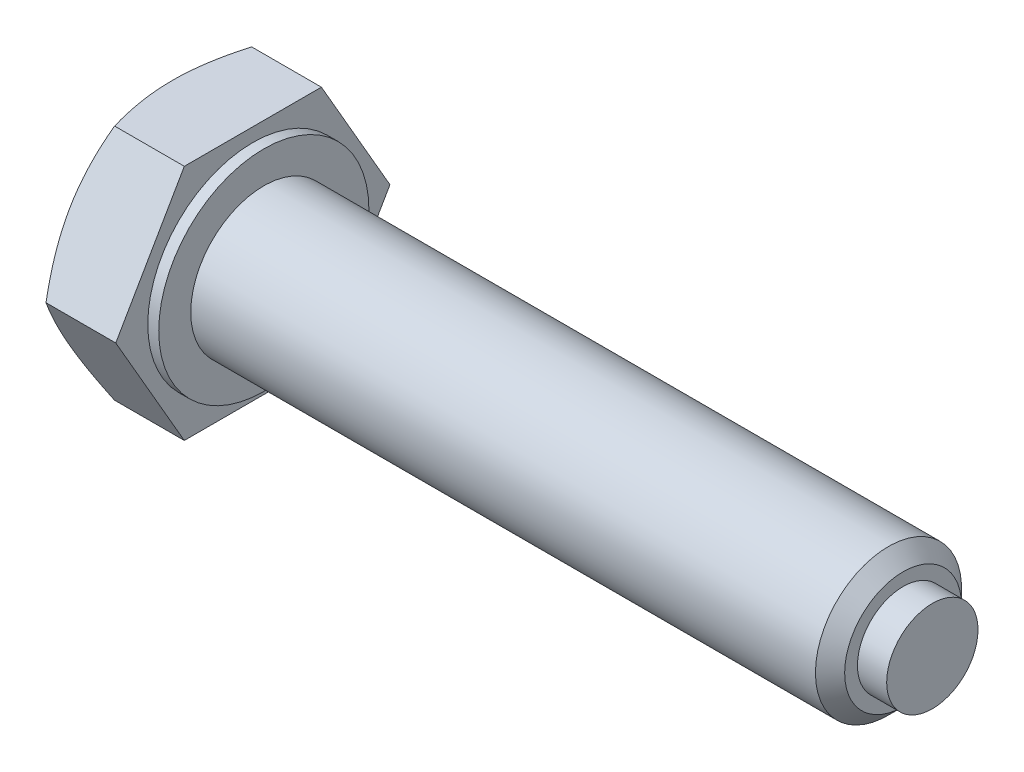
ISO-10303-21;
HEADER;
FILE_DESCRIPTION(('STEP AP214'),'2;1');
FILE_NAME('part.step','',(''),(''),'','','');
FILE_SCHEMA(('AUTOMOTIVE_DESIGN { 1 0 10303 214 1 1 1 1 }'));
ENDSEC;
DATA;
#1=APPLICATION_CONTEXT('core data for automotive mechanical design processes');
#2=APPLICATION_PROTOCOL_DEFINITION('international standard','automotive_design',2000,#1);
#3=PRODUCT_CONTEXT('',#1,'mechanical');
#4=PRODUCT('Part','Part','',(#3));
#5=PRODUCT_RELATED_PRODUCT_CATEGORY('part','',(#4));
#6=PRODUCT_DEFINITION_FORMATION('','',#4);
#7=PRODUCT_DEFINITION_CONTEXT('part definition',#1,'design');
#8=PRODUCT_DEFINITION('design','',#6,#7);
#9=PRODUCT_DEFINITION_SHAPE('','',#8);
#10=(LENGTH_UNIT() NAMED_UNIT(*) SI_UNIT(.MILLI.,.METRE.));
#11=(NAMED_UNIT(*) PLANE_ANGLE_UNIT() SI_UNIT($,.RADIAN.));
#12=(NAMED_UNIT(*) SI_UNIT($,.STERADIAN.) SOLID_ANGLE_UNIT());
#13=UNCERTAINTY_MEASURE_WITH_UNIT(LENGTH_MEASURE(1.E-05),#10,'distance_accuracy_value','');
#14=(GEOMETRIC_REPRESENTATION_CONTEXT(3) GLOBAL_UNCERTAINTY_ASSIGNED_CONTEXT((#13)) GLOBAL_UNIT_ASSIGNED_CONTEXT((#10,
#11,#12)) REPRESENTATION_CONTEXT('',''));
#15=CARTESIAN_POINT('',(0.,0.,0.));
#16=DIRECTION('',(0.,0.,1.));
#17=DIRECTION('',(1.,0.,0.));
#18=AXIS2_PLACEMENT_3D('',#15,#16,#17);
#19=CARTESIAN_POINT('',(4.99999999999989,-3.25000000000036,-5.62916512459921));
#20=DIRECTION('',(0.,-0.500000000000007,-0.866025403784451));
#21=DIRECTION('',(0.,-0.866025403784451,0.500000000000007));
#22=AXIS2_PLACEMENT_3D('',#19,#20,#21);
#23=PLANE('',#22);
#24=CARTESIAN_POINT('',(-4.4194434163996,-6.50000000000041,-3.7527767497329));
#25=CARTESIAN_POINT('',(-4.70121119604637,-5.65469666106277,-4.24081286001544));
#26=CARTESIAN_POINT('',(-4.84366714919919,-4.89166385268671,-4.68135005733187));
#27=CARTESIAN_POINT('',(-5.00000000000039,-4.0543026083986,-5.16480079713057));
#28=CARTESIAN_POINT('',(-5.00000000000039,-3.25000000000036,-5.62916512459921));
#29=B_SPLINE_CURVE_WITH_KNOTS('',2,(#24,#25,#26,#27,#28),.UNSPECIFIED.,.F.,.F.,(3,2,3),(0.,0.5,
1.),.UNSPECIFIED.);
#30=CARTESIAN_POINT('',(-4.41944341639933,-6.50000000000034,-3.75277674973343));
#31=VERTEX_POINT('',#30);
#32=CARTESIAN_POINT('',(-4.99999999999989,-3.25000000000036,-5.62916512459921));
#33=VERTEX_POINT('',#32);
#34=EDGE_CURVE('E437',#31,#33,#29,.T.);
#35=ORIENTED_EDGE('',*,*,#34,.T.);
#36=CARTESIAN_POINT('',(-5.00000000000039,-3.25000000000036,-5.62916512459921));
#37=CARTESIAN_POINT('',(-5.00000000000039,-2.44516175633019,-6.09383870123629));
#38=CARTESIAN_POINT('',(-4.84328039134601,-1.60626522925969,-6.57817583696269));
#39=CARTESIAN_POINT('',(-4.70100428714844,-0.844682612245449,-7.017875765906));
#40=CARTESIAN_POINT('',(-4.4194434163996,-3.15719672627779E-13,-7.50555349946552));
#41=B_SPLINE_CURVE_WITH_KNOTS('',2,(#36,#37,#38,#39,#40),.UNSPECIFIED.,.F.,.F.,(3,2,3),(0.,0.5,
1.),.UNSPECIFIED.);
#42=CARTESIAN_POINT('',(-4.41944341639933,-2.22044604925031E-13,-7.50555349946475));
#43=VERTEX_POINT('',#42);
#44=EDGE_CURVE('E446',#33,#43,#41,.T.);
#45=ORIENTED_EDGE('',*,*,#44,.T.);
#46=DIRECTION('',(-1.,0.,0.));
#47=VECTOR('',#46,1.);
#48=CARTESIAN_POINT('',(4.99999999999989,-2.22044604925031E-13,-7.50555349946475));
#49=LINE('',#48,#47);
#50=CARTESIAN_POINT('',(-0.599999999999934,-2.22044604925031E-13,-7.50555349946475));
#51=VERTEX_POINT('',#50);
#52=EDGE_CURVE('E296',#51,#43,#49,.T.);
#53=ORIENTED_EDGE('',*,*,#52,.F.);
#54=DIRECTION('',(0.,-0.866025403784451,0.500000000000007));
#55=VECTOR('',#54,1.);
#56=CARTESIAN_POINT('',(-0.599999999999934,2.37916512459857,-8.87916512459883));
#57=LINE('',#56,#55);
#58=CARTESIAN_POINT('',(-0.599999999999934,-6.50000000000034,-3.75277674973343));
#59=VERTEX_POINT('',#58);
#60=EDGE_CURVE('E416',#51,#59,#57,.T.);
#61=ORIENTED_EDGE('',*,*,#60,.T.);
#62=DIRECTION('',(-1.,0.,0.));
#63=VECTOR('',#62,1.);
#64=CARTESIAN_POINT('',(4.99999999999989,-6.50000000000034,-3.75277674973343));
#65=LINE('',#64,#63);
#66=EDGE_CURVE('E11',#59,#31,#65,.T.);
#67=ORIENTED_EDGE('',*,*,#66,.T.);
#68=EDGE_LOOP('',(#35,#45,#53,#61,#67));
#69=FACE_BOUND('',#68,.T.);
#70=ADVANCED_FACE('F16',(#69),#23,.T.);
#71=CARTESIAN_POINT('',(4.99999999999989,-6.50000000000123,-5.27355936696949E-13));
#72=DIRECTION('',(0.,-1.00000000000001,0.));
#73=DIRECTION('',(0.,0.,-1.00000000000001));
#74=AXIS2_PLACEMENT_3D('',#71,#72,#73);
#75=PLANE('',#74);
#76=CARTESIAN_POINT('',(-4.4194434163996,-6.50000000000123,3.75277674973209));
#77=CARTESIAN_POINT('',(-4.69982369058386,-6.50000000000123,2.78151098907765));
#78=CARTESIAN_POINT('',(-4.84223781480018,-6.50000000000123,1.90445380224181));
#79=CARTESIAN_POINT('',(-5.00000000000038,-6.50000000000123,0.932875603083793));
#80=CARTESIAN_POINT('',(-5.00000000000038,-6.50000000000123,-5.27355936696949E-13));
#81=B_SPLINE_CURVE_WITH_KNOTS('',2,(#76,#77,#78,#79,#80),.UNSPECIFIED.,.F.,.F.,(3,2,3),(0.,0.5,
1.),.UNSPECIFIED.);
#82=CARTESIAN_POINT('',(-4.41944341639933,-6.50000000000101,3.75277674973262));
#83=VERTEX_POINT('',#82);
#84=CARTESIAN_POINT('',(-4.99999999999989,-6.50000000000123,-5.27355936696949E-13));
#85=VERTEX_POINT('',#84);
#86=EDGE_CURVE('E142',#83,#85,#81,.T.);
#87=ORIENTED_EDGE('',*,*,#86,.T.);
#88=CARTESIAN_POINT('',(-5.00000000000038,-6.50000000000123,-5.27355936696949E-13));
#89=CARTESIAN_POINT('',(-5.00000000000038,-6.50000000000123,-0.925923553282188));
#90=CARTESIAN_POINT('',(-4.84445525213732,-6.50000000000123,-1.89074873679887));
#91=CARTESIAN_POINT('',(-4.7021494592843,-6.50000000000123,-2.77345428996721));
#92=CARTESIAN_POINT('',(-4.4194434163996,-6.50000000000123,-3.75277674973315));
#93=B_SPLINE_CURVE_WITH_KNOTS('',2,(#88,#89,#90,#91,#92),.UNSPECIFIED.,.F.,.F.,(3,2,3),(0.,0.5,
1.),.UNSPECIFIED.);
#94=EDGE_CURVE('E431',#85,#31,#93,.T.);
#95=ORIENTED_EDGE('',*,*,#94,.T.);
#96=ORIENTED_EDGE('',*,*,#66,.F.);
#97=DIRECTION('',(0.,0.,1.00000000000001));
#98=VECTOR('',#97,1.);
#99=CARTESIAN_POINT('',(-0.599999999999934,-6.50000000000123,-5.27355936696949E-13));
#100=LINE('',#99,#98);
#101=CARTESIAN_POINT('',(-0.599999999999934,-6.50000000000101,3.75277674973262));
#102=VERTEX_POINT('',#101);
#103=EDGE_CURVE('E146',#59,#102,#100,.T.);
#104=ORIENTED_EDGE('',*,*,#103,.T.);
#105=DIRECTION('',(-1.,0.,0.));
#106=VECTOR('',#105,1.);
#107=CARTESIAN_POINT('',(4.99999999999989,-6.50000000000101,3.75277674973262));
#108=LINE('',#107,#106);
#109=EDGE_CURVE('E28',#102,#83,#108,.T.);
#110=ORIENTED_EDGE('',*,*,#109,.T.);
#111=EDGE_LOOP('',(#87,#95,#96,#104,#110));
#112=FACE_BOUND('',#111,.T.);
#113=ADVANCED_FACE('F139',(#112),#75,.T.);
#114=CARTESIAN_POINT('',(4.99999999999989,-3.25000000000103,5.62916512459907));
#115=DIRECTION('',(0.,-0.500000000000006,0.86602540378445));
#116=DIRECTION('',(-1.,0.,0.));
#117=AXIS2_PLACEMENT_3D('',#114,#115,#116);
#118=PLANE('',#117);
#119=CARTESIAN_POINT('',(-4.41944341639934,-9.8879238130678E-13,7.50555349946538));
#120=CARTESIAN_POINT('',(-4.70121119604643,-0.845303338939596,7.01751738918229));
#121=CARTESIAN_POINT('',(-4.84366714919891,-1.60833614731469,6.57698019186641));
#122=CARTESIAN_POINT('',(-5.00000000000011,-2.44569739160364,6.09352945206722));
#123=CARTESIAN_POINT('',(-5.00000000000011,-3.25000000000103,5.62916512459907));
#124=B_SPLINE_CURVE_WITH_KNOTS('',2,(#119,#120,#121,#122,#123),.UNSPECIFIED.,.F.,.F.,(3,2,3),
(0.,0.5,1.),.UNSPECIFIED.);
#125=CARTESIAN_POINT('',(-4.41944341639933,-6.66133814775094E-13,7.5055534994653));
#126=VERTEX_POINT('',#125);
#127=CARTESIAN_POINT('',(-4.99999999999989,-3.25000000000103,5.62916512459907));
#128=VERTEX_POINT('',#127);
#129=EDGE_CURVE('E159',#126,#128,#124,.T.);
#130=ORIENTED_EDGE('',*,*,#129,.T.);
#131=CARTESIAN_POINT('',(-5.00000000000011,-3.25000000000103,5.62916512459907));
#132=CARTESIAN_POINT('',(-5.00000000000011,-4.0548382436712,5.16449154796199));
#133=CARTESIAN_POINT('',(-4.84328039134573,-4.8937347707417,4.6801544122356));
#134=CARTESIAN_POINT('',(-4.70100428714817,-5.65531738775594,4.24045448329229));
#135=CARTESIAN_POINT('',(-4.41944341639934,-6.50000000000107,3.75277674973276));
#136=B_SPLINE_CURVE_WITH_KNOTS('',2,(#131,#132,#133,#134,#135),.UNSPECIFIED.,.F.,.F.,(3,2,3),
(0.,0.5,1.),.UNSPECIFIED.);
#137=EDGE_CURVE('E155',#128,#83,#136,.T.);
#138=ORIENTED_EDGE('',*,*,#137,.T.);
#139=ORIENTED_EDGE('',*,*,#109,.F.);
#140=DIRECTION('',(0.,0.86602540378445,0.500000000000006));
#141=VECTOR('',#140,1.);
#142=CARTESIAN_POINT('',(-0.599999999999934,2.37916512459868,8.87916512459883));
#143=LINE('',#142,#141);
#144=CARTESIAN_POINT('',(-0.599999999999934,-6.66133814775094E-13,7.5055534994653));
#145=VERTEX_POINT('',#144);
#146=EDGE_CURVE('E389',#102,#145,#143,.T.);
#147=ORIENTED_EDGE('',*,*,#146,.T.);
#148=DIRECTION('',(-1.,0.,0.));
#149=VECTOR('',#148,1.);
#150=CARTESIAN_POINT('',(4.99999999999989,-6.66133814775094E-13,7.5055534994653));
#151=LINE('',#150,#149);
#152=EDGE_CURVE('E151',#145,#126,#151,.T.);
#153=ORIENTED_EDGE('',*,*,#152,.T.);
#154=EDGE_LOOP('',(#130,#138,#139,#147,#153));
#155=FACE_BOUND('',#154,.T.);
#156=ADVANCED_FACE('F157',(#155),#118,.T.);
#157=CARTESIAN_POINT('',(4.99999999999989,3.24999999999931,5.62916512459874));
#158=DIRECTION('',(0.,0.500000000000007,0.866025403784451));
#159=DIRECTION('',(1.,0.,0.));
#160=AXIS2_PLACEMENT_3D('',#157,#158,#159);
#161=PLANE('',#160);
#162=CARTESIAN_POINT('',(-4.41944341639934,6.49999999999936,3.75277674973243));
#163=CARTESIAN_POINT('',(-4.70121119604959,5.65469666105128,4.24081286002099));
#164=CARTESIAN_POINT('',(-4.84366714919891,4.89166385268566,4.6813500573314));
#165=CARTESIAN_POINT('',(-5.00000000000011,4.05430260838852,5.16480079713531));
#166=CARTESIAN_POINT('',(-5.00000000000011,3.24999999999931,5.62916512459874));
#167=B_SPLINE_CURVE_WITH_KNOTS('',2,(#162,#163,#164,#165,#166),.UNSPECIFIED.,.F.,.F.,(3,2,3),
(0.,0.5,1.),.UNSPECIFIED.);
#168=CARTESIAN_POINT('',(-4.41944341639933,6.49999999999945,3.75277674973198));
#169=VERTEX_POINT('',#168);
#170=CARTESIAN_POINT('',(-4.99999999999989,3.24999999999931,5.62916512459874));
#171=VERTEX_POINT('',#170);
#172=EDGE_CURVE('E337',#169,#171,#167,.T.);
#173=ORIENTED_EDGE('',*,*,#172,.T.);
#174=CARTESIAN_POINT('',(-5.00000000000011,3.24999999999931,5.62916512459874));
#175=CARTESIAN_POINT('',(-5.00000000000011,2.44516175633667,6.09383870123147));
#176=CARTESIAN_POINT('',(-4.84328039134573,1.60626522925864,6.57817583696221));
#177=CARTESIAN_POINT('',(-4.70100428715108,0.844682612253115,7.01787576590049));
#178=CARTESIAN_POINT('',(-4.41944341639934,-7.34655392076178E-13,7.50555349946505));
#179=B_SPLINE_CURVE_WITH_KNOTS('',2,(#174,#175,#176,#177,#178),.UNSPECIFIED.,.F.,.F.,(3,2,3),
(0.,0.5,1.),.UNSPECIFIED.);
#180=EDGE_CURVE('E352',#171,#126,#179,.T.);
#181=ORIENTED_EDGE('',*,*,#180,.T.);
#182=ORIENTED_EDGE('',*,*,#152,.F.);
#183=DIRECTION('',(0.,0.866025403784451,-0.500000000000007));
#184=VECTOR('',#183,1.);
#185=CARTESIAN_POINT('',(-0.599999999999934,8.8791651245988,2.37916512459857));
#186=LINE('',#185,#184);
#187=CARTESIAN_POINT('',(-0.599999999999934,6.49999999999945,3.75277674973198));
#188=VERTEX_POINT('',#187);
#189=EDGE_CURVE('E395',#145,#188,#186,.T.);
#190=ORIENTED_EDGE('',*,*,#189,.T.);
#191=DIRECTION('',(-1.,0.,0.));
#192=VECTOR('',#191,1.);
#193=CARTESIAN_POINT('',(4.99999999999989,6.49999999999945,3.75277674973198));
#194=LINE('',#193,#192);
#195=EDGE_CURVE('E518',#188,#169,#194,.T.);
#196=ORIENTED_EDGE('',*,*,#195,.T.);
#197=EDGE_LOOP('',(#173,#181,#182,#190,#196));
#198=FACE_BOUND('',#197,.T.);
#199=ADVANCED_FACE('F280',(#198),#161,.T.);
#200=CARTESIAN_POINT('',(4.99999999999989,6.49999999999928,3.05311331771918E-13));
#201=DIRECTION('',(0.,1.00000000000001,0.));
#202=DIRECTION('',(0.,0.,-1.00000000000001));
#203=AXIS2_PLACEMENT_3D('',#200,#201,#202);
#204=PLANE('',#203);
#205=CARTESIAN_POINT('',(-4.4194434163996,6.49999999999928,-3.75277674973232));
#206=CARTESIAN_POINT('',(-4.70197801965504,6.49999999999928,-2.77404817426298));
#207=CARTESIAN_POINT('',(-4.84445525213732,6.49999999999928,-1.89074873679804));
#208=CARTESIAN_POINT('',(-5.00000000000038,6.49999999999928,-0.926436152293174));
#209=CARTESIAN_POINT('',(-5.00000000000038,6.49999999999928,3.05311331771918E-13));
#210=B_SPLINE_CURVE_WITH_KNOTS('',2,(#205,#206,#207,#208,#209),.UNSPECIFIED.,.F.,.F.,(3,2,3),
(0.,0.5,1.),.UNSPECIFIED.);
#211=CARTESIAN_POINT('',(-4.41944341639933,6.49999999999956,-3.75277674973223));
#212=VERTEX_POINT('',#211);
#213=CARTESIAN_POINT('',(-4.99999999999989,6.49999999999928,3.05311331771918E-13));
#214=VERTEX_POINT('',#213);
#215=EDGE_CURVE('E258',#212,#214,#210,.T.);
#216=ORIENTED_EDGE('',*,*,#215,.T.);
#217=CARTESIAN_POINT('',(-5.00000000000038,6.49999999999928,3.05311331771918E-13));
#218=CARTESIAN_POINT('',(-5.00000000000038,6.49999999999928,0.932359564464189));
#219=CARTESIAN_POINT('',(-4.84223781480018,6.49999999999928,1.90445380224265));
#220=CARTESIAN_POINT('',(-4.69999637130632,6.49999999999928,2.78091280550888));
#221=CARTESIAN_POINT('',(-4.4194434163996,6.49999999999928,3.75277674973292));
#222=B_SPLINE_CURVE_WITH_KNOTS('',2,(#217,#218,#219,#220,#221),.UNSPECIFIED.,.F.,.F.,(3,2,3),
(0.,0.5,1.),.UNSPECIFIED.);
#223=EDGE_CURVE('E259',#214,#169,#222,.T.);
#224=ORIENTED_EDGE('',*,*,#223,.T.);
#225=ORIENTED_EDGE('',*,*,#195,.F.);
#226=DIRECTION('',(0.,0.,-1.00000000000001));
#227=VECTOR('',#226,1.);
#228=CARTESIAN_POINT('',(-0.599999999999934,6.49999999999928,3.05311331771918E-13));
#229=LINE('',#228,#227);
#230=CARTESIAN_POINT('',(-0.599999999999934,6.49999999999956,-3.75277674973223));
#231=VERTEX_POINT('',#230);
#232=EDGE_CURVE('E403',#188,#231,#229,.T.);
#233=ORIENTED_EDGE('',*,*,#232,.T.);
#234=DIRECTION('',(-1.,0.,0.));
#235=VECTOR('',#234,1.);
#236=CARTESIAN_POINT('',(4.99999999999989,6.49999999999956,-3.75277674973223));
#237=LINE('',#236,#235);
#238=EDGE_CURVE('E42',#231,#212,#237,.T.);
#239=ORIENTED_EDGE('',*,*,#238,.T.);
#240=EDGE_LOOP('',(#216,#224,#225,#233,#239));
#241=FACE_BOUND('',#240,.T.);
#242=ADVANCED_FACE('F270',(#241),#204,.T.);
#243=CARTESIAN_POINT('',(4.99999999999989,3.2500000000002,-5.62916512459891));
#244=DIRECTION('',(0.,0.500000000000006,-0.86602540378445));
#245=DIRECTION('',(-1.,0.,0.));
#246=AXIS2_PLACEMENT_3D('',#243,#244,#245);
#247=PLANE('',#246);
#248=CARTESIAN_POINT('',(-4.41944341639934,1.56125112837913E-13,-7.50555349946521));
#249=CARTESIAN_POINT('',(-4.70121119604637,0.845303338938572,-7.01751738918223));
#250=CARTESIAN_POINT('',(-4.84366714919891,1.60833614731385,-6.57698019186625));
#251=CARTESIAN_POINT('',(-5.00000000000011,2.44569739160264,-6.09352945206716));
#252=CARTESIAN_POINT('',(-5.00000000000011,3.2500000000002,-5.62916512459891));
#253=B_SPLINE_CURVE_WITH_KNOTS('',2,(#248,#249,#250,#251,#252),.UNSPECIFIED.,.F.,.F.,(3,2,3),
(0.,0.5,1.),.UNSPECIFIED.);
#254=CARTESIAN_POINT('',(-4.99999999999989,3.2500000000002,-5.62916512459891));
#255=VERTEX_POINT('',#254);
#256=EDGE_CURVE('E304',#43,#255,#253,.T.);
#257=ORIENTED_EDGE('',*,*,#256,.T.);
#258=CARTESIAN_POINT('',(-5.00000000000011,3.2500000000002,-5.62916512459891));
#259=CARTESIAN_POINT('',(-5.00000000000011,4.05483824367104,-5.16449154796144));
#260=CARTESIAN_POINT('',(-4.84328039134573,4.89373477074087,-4.68015441223543));
#261=CARTESIAN_POINT('',(-4.70100428714791,5.65531738775587,-4.24045448329168));
#262=CARTESIAN_POINT('',(-4.41944341639934,6.50000000000024,-3.7527767497326));
#263=B_SPLINE_CURVE_WITH_KNOTS('',2,(#258,#259,#260,#261,#262),.UNSPECIFIED.,.F.,.F.,(3,2,3),
(0.,0.5,1.),.UNSPECIFIED.);
#264=EDGE_CURVE('E308',#255,#212,#263,.T.);
#265=ORIENTED_EDGE('',*,*,#264,.T.);
#266=ORIENTED_EDGE('',*,*,#238,.F.);
#267=DIRECTION('',(0.,-0.86602540378445,-0.500000000000006));
#268=VECTOR('',#267,1.);
#269=CARTESIAN_POINT('',(-0.599999999999934,8.87916512459808,-2.37916512459896));
#270=LINE('',#269,#268);
#271=EDGE_CURVE('E409',#231,#51,#270,.T.);
#272=ORIENTED_EDGE('',*,*,#271,.T.);
#273=ORIENTED_EDGE('',*,*,#52,.T.);
#274=EDGE_LOOP('',(#257,#265,#266,#272,#273));
#275=FACE_BOUND('',#274,.T.);
#276=ADVANCED_FACE('F279',(#275),#247,.T.);
#277=CARTESIAN_POINT('',(-4.99999999999989,0.,0.));
#278=DIRECTION('',(1.,0.,0.));
#279=DIRECTION('',(0.,1.00000000000001,0.));
#280=AXIS2_PLACEMENT_3D('',#277,#278,#279);
#281=PLANE('',#280);
#282=CARTESIAN_POINT('',(-4.99999999999989,0.,0.));
#283=DIRECTION('',(-1.,0.,0.));
#284=DIRECTION('',(0.,0.,1.00000000000001));
#285=AXIS2_PLACEMENT_3D('',#282,#283,#284);
#286=CIRCLE('',#285,6.5);
#287=EDGE_CURVE('E300',#255,#33,#286,.T.);
#288=ORIENTED_EDGE('',*,*,#287,.T.);
#289=CARTESIAN_POINT('',(-4.99999999999989,0.,0.));
#290=DIRECTION('',(-1.,0.,0.));
#291=DIRECTION('',(0.,0.,1.00000000000001));
#292=AXIS2_PLACEMENT_3D('',#289,#290,#291);
#293=CIRCLE('',#292,6.5);
#294=EDGE_CURVE('E180',#33,#85,#293,.T.);
#295=ORIENTED_EDGE('',*,*,#294,.T.);
#296=CARTESIAN_POINT('',(-4.99999999999989,0.,0.));
#297=DIRECTION('',(-1.,0.,0.));
#298=DIRECTION('',(0.,0.,1.00000000000001));
#299=AXIS2_PLACEMENT_3D('',#296,#297,#298);
#300=CIRCLE('',#299,6.5);
#301=EDGE_CURVE('E165',#85,#128,#300,.T.);
#302=ORIENTED_EDGE('',*,*,#301,.T.);
#303=CARTESIAN_POINT('',(-4.99999999999989,0.,0.));
#304=DIRECTION('',(-1.,0.,0.));
#305=DIRECTION('',(0.,0.,1.00000000000001));
#306=AXIS2_PLACEMENT_3D('',#303,#304,#305);
#307=CIRCLE('',#306,6.5);
#308=EDGE_CURVE('E345',#128,#171,#307,.T.);
#309=ORIENTED_EDGE('',*,*,#308,.T.);
#310=CARTESIAN_POINT('',(-4.99999999999989,0.,0.));
#311=DIRECTION('',(-1.,0.,0.));
#312=DIRECTION('',(0.,0.,1.00000000000001));
#313=AXIS2_PLACEMENT_3D('',#310,#311,#312);
#314=CIRCLE('',#313,6.5);
#315=EDGE_CURVE('E249',#171,#214,#314,.T.);
#316=ORIENTED_EDGE('',*,*,#315,.T.);
#317=CARTESIAN_POINT('',(-4.99999999999989,0.,0.));
#318=DIRECTION('',(-1.,0.,0.));
#319=DIRECTION('',(0.,0.,1.00000000000001));
#320=AXIS2_PLACEMENT_3D('',#317,#318,#319);
#321=CIRCLE('',#320,6.5);
#322=EDGE_CURVE('E297',#214,#255,#321,.T.);
#323=ORIENTED_EDGE('',*,*,#322,.T.);
#324=EDGE_LOOP('',(#288,#295,#302,#309,#316,#323));
#325=FACE_BOUND('',#324,.T.);
#326=ADVANCED_FACE('F222',(#325),#281,.F.);
#327=CARTESIAN_POINT('',(36.6,2.50000000000017,-1.66533453693773E-13));
#328=DIRECTION('',(-1.,0.,0.));
#329=DIRECTION('',(0.,0.,1.00000000000001));
#330=AXIS2_PLACEMENT_3D('',#327,#328,#329);
#331=PLANE('',#330);
#332=CARTESIAN_POINT('',(36.6,0.,0.));
#333=DIRECTION('',(-1.,0.,0.));
#334=DIRECTION('',(0.,0.,1.00000000000001));
#335=AXIS2_PLACEMENT_3D('',#332,#333,#334);
#336=CIRCLE('',#335,2.5);
#337=CARTESIAN_POINT('',(36.6,0.,-2.50000000000017));
#338=VERTEX_POINT('',#337);
#339=EDGE_CURVE('E502',#338,#338,#336,.T.);
#340=ORIENTED_EDGE('',*,*,#339,.F.);
#341=EDGE_LOOP('',(#340));
#342=FACE_BOUND('',#341,.T.);
#343=ADVANCED_FACE('F218',(#342),#331,.F.);
#344=CARTESIAN_POINT('',(34.9999999999999,3.19999999999965,6.93889390390723E-13));
#345=DIRECTION('',(-1.,0.,0.));
#346=DIRECTION('',(0.,0.,1.00000000000001));
#347=AXIS2_PLACEMENT_3D('',#344,#345,#346);
#348=PLANE('',#347);
#349=CARTESIAN_POINT('',(34.9999999999999,0.,0.));
#350=DIRECTION('',(-1.,0.,0.));
#351=DIRECTION('',(0.,0.,1.00000000000001));
#352=AXIS2_PLACEMENT_3D('',#349,#350,#351);
#353=CIRCLE('',#352,2.5);
#354=CARTESIAN_POINT('',(34.9999999999999,-9.43689570931383E-13,2.50000000000034));
#355=VERTEX_POINT('',#354);
#356=EDGE_CURVE('E494',#355,#355,#353,.T.);
#357=ORIENTED_EDGE('',*,*,#356,.T.);
#358=EDGE_LOOP('',(#357));
#359=FACE_BOUND('',#358,.T.);
#360=CARTESIAN_POINT('',(34.9999999999999,0.,0.));
#361=DIRECTION('',(-1.,0.,0.));
#362=DIRECTION('',(0.,0.,1.00000000000001));
#363=AXIS2_PLACEMENT_3D('',#360,#361,#362);
#364=CIRCLE('',#363,3.2);
#365=CARTESIAN_POINT('',(34.9999999999999,-1.11022302462516E-13,-3.20000000000023));
#366=VERTEX_POINT('',#365);
#367=EDGE_CURVE('E487',#366,#366,#364,.T.);
#368=ORIENTED_EDGE('',*,*,#367,.F.);
#369=EDGE_LOOP('',(#368));
#370=FACE_BOUND('',#369,.T.);
#371=ADVANCED_FACE('F221',(#359,#370),#348,.F.);
#372=CARTESIAN_POINT('',(0.,5.7527767497319,-2.22044604925031E-13));
#373=DIRECTION('',(-1.,0.,0.));
#374=DIRECTION('',(0.,0.,1.00000000000001));
#375=AXIS2_PLACEMENT_3D('',#372,#373,#374);
#376=PLANE('',#375);
#377=CARTESIAN_POINT('',(0.,0.,0.));
#378=DIRECTION('',(-1.,0.,0.));
#379=DIRECTION('',(0.,0.,1.00000000000001));
#380=AXIS2_PLACEMENT_3D('',#377,#378,#379);
#381=CIRCLE('',#380,4.);
#382=CARTESIAN_POINT('',(0.,-1.38777878078145E-12,3.99999999999998));
#383=VERTEX_POINT('',#382);
#384=EDGE_CURVE('E473',#383,#383,#381,.T.);
#385=ORIENTED_EDGE('',*,*,#384,.T.);
#386=EDGE_LOOP('',(#385));
#387=FACE_BOUND('',#386,.T.);
#388=CARTESIAN_POINT('',(0.,0.,0.));
#389=DIRECTION('',(-1.,0.,0.));
#390=DIRECTION('',(0.,0.,1.00000000000001));
#391=AXIS2_PLACEMENT_3D('',#388,#389,#390);
#392=CIRCLE('',#391,5.75277674973257);
#393=CARTESIAN_POINT('',(0.,0.,-5.75277674973226));
#394=VERTEX_POINT('',#393);
#395=EDGE_CURVE('E466',#394,#394,#392,.T.);
#396=ORIENTED_EDGE('',*,*,#395,.F.);
#397=EDGE_LOOP('',(#396));
#398=FACE_BOUND('',#397,.T.);
#399=ADVANCED_FACE('F226',(#387,#398),#376,.F.);
#400=CARTESIAN_POINT('',(-4.41944341639933,0.,0.));
#401=DIRECTION('',(1.,0.,0.));
#402=DIRECTION('',(0.,0.,-1.00000000000001));
#403=AXIS2_PLACEMENT_3D('',#400,#401,#402);
#404=CONICAL_SURFACE('',#403,7.50555349946513,1.0471975511966);
#405=ORIENTED_EDGE('',*,*,#215,.F.);
#406=ORIENTED_EDGE('',*,*,#264,.F.);
#407=ORIENTED_EDGE('',*,*,#322,.F.);
#408=EDGE_LOOP('',(#405,#406,#407));
#409=FACE_BOUND('',#408,.T.);
#410=ADVANCED_FACE('F228',(#409),#404,.T.);
#411=CARTESIAN_POINT('',(-4.41944341639933,0.,0.));
#412=DIRECTION('',(1.,0.,0.));
#413=DIRECTION('',(0.,0.,-1.00000000000001));
#414=AXIS2_PLACEMENT_3D('',#411,#412,#413);
#415=CONICAL_SURFACE('',#414,7.50555349946513,1.0471975511966);
#416=ORIENTED_EDGE('',*,*,#172,.F.);
#417=ORIENTED_EDGE('',*,*,#223,.F.);
#418=ORIENTED_EDGE('',*,*,#315,.F.);
#419=EDGE_LOOP('',(#416,#417,#418));
#420=FACE_BOUND('',#419,.T.);
#421=ADVANCED_FACE('F232',(#420),#415,.T.);
#422=CARTESIAN_POINT('',(-4.41944341639933,0.,0.));
#423=DIRECTION('',(1.,0.,0.));
#424=DIRECTION('',(0.,0.,-1.00000000000001));
#425=AXIS2_PLACEMENT_3D('',#422,#423,#424);
#426=CONICAL_SURFACE('',#425,7.50555349946513,1.0471975511966);
#427=ORIENTED_EDGE('',*,*,#129,.F.);
#428=ORIENTED_EDGE('',*,*,#180,.F.);
#429=ORIENTED_EDGE('',*,*,#308,.F.);
#430=EDGE_LOOP('',(#427,#428,#429));
#431=FACE_BOUND('',#430,.T.);
#432=ADVANCED_FACE('F192',(#431),#426,.T.);
#433=CARTESIAN_POINT('',(-4.41944341639933,0.,0.));
#434=DIRECTION('',(1.,0.,0.));
#435=DIRECTION('',(0.,0.,-1.00000000000001));
#436=AXIS2_PLACEMENT_3D('',#433,#434,#435);
#437=CONICAL_SURFACE('',#436,7.50555349946513,1.0471975511966);
#438=ORIENTED_EDGE('',*,*,#86,.F.);
#439=ORIENTED_EDGE('',*,*,#137,.F.);
#440=ORIENTED_EDGE('',*,*,#301,.F.);
#441=EDGE_LOOP('',(#438,#439,#440));
#442=FACE_BOUND('',#441,.T.);
#443=ADVANCED_FACE('F169',(#442),#437,.T.);
#444=CARTESIAN_POINT('',(-0.599999999999934,7.50555349946452,0.));
#445=DIRECTION('',(-1.,0.,0.));
#446=DIRECTION('',(0.,0.,1.00000000000001));
#447=AXIS2_PLACEMENT_3D('',#444,#445,#446);
#448=PLANE('',#447);
#449=CARTESIAN_POINT('',(-0.599999999999934,0.,0.));
#450=DIRECTION('',(-1.,0.,0.));
#451=DIRECTION('',(0.,0.,1.00000000000001));
#452=AXIS2_PLACEMENT_3D('',#449,#450,#451);
#453=CIRCLE('',#452,5.75277674973257);
#454=CARTESIAN_POINT('',(-0.599999999999934,-1.11022302462516E-12,5.75277674973315));
#455=VERTEX_POINT('',#454);
#456=EDGE_CURVE('E305',#455,#455,#453,.T.);
#457=ORIENTED_EDGE('',*,*,#456,.T.);
#458=EDGE_LOOP('',(#457));
#459=FACE_BOUND('',#458,.T.);
#460=ORIENTED_EDGE('',*,*,#60,.F.);
#461=ORIENTED_EDGE('',*,*,#271,.F.);
#462=ORIENTED_EDGE('',*,*,#232,.F.);
#463=ORIENTED_EDGE('',*,*,#189,.F.);
#464=ORIENTED_EDGE('',*,*,#146,.F.);
#465=ORIENTED_EDGE('',*,*,#103,.F.);
#466=EDGE_LOOP('',(#460,#461,#462,#463,#464,#465));
#467=FACE_BOUND('',#466,.T.);
#468=ADVANCED_FACE('F191',(#459,#467),#448,.F.);
#469=CARTESIAN_POINT('',(-4.41944341639933,0.,0.));
#470=DIRECTION('',(1.,0.,0.));
#471=DIRECTION('',(0.,0.,-1.00000000000001));
#472=AXIS2_PLACEMENT_3D('',#469,#470,#471);
#473=CONICAL_SURFACE('',#472,7.50555349946513,1.0471975511966);
#474=ORIENTED_EDGE('',*,*,#34,.F.);
#475=ORIENTED_EDGE('',*,*,#94,.F.);
#476=ORIENTED_EDGE('',*,*,#294,.F.);
#477=EDGE_LOOP('',(#474,#475,#476));
#478=FACE_BOUND('',#477,.T.);
#479=ADVANCED_FACE('F614',(#478),#473,.T.);
#480=CARTESIAN_POINT('',(-4.41944341639933,0.,0.));
#481=DIRECTION('',(1.,0.,0.));
#482=DIRECTION('',(0.,0.,-1.00000000000001));
#483=AXIS2_PLACEMENT_3D('',#480,#481,#482);
#484=CONICAL_SURFACE('',#483,7.50555349946513,1.0471975511966);
#485=ORIENTED_EDGE('',*,*,#287,.F.);
#486=ORIENTED_EDGE('',*,*,#256,.F.);
#487=ORIENTED_EDGE('',*,*,#44,.F.);
#488=EDGE_LOOP('',(#485,#486,#487));
#489=FACE_BOUND('',#488,.T.);
#490=ADVANCED_FACE('F680',(#489),#484,.T.);
#491=CARTESIAN_POINT('',(0.,0.,0.));
#492=DIRECTION('',(-1.,0.,0.));
#493=DIRECTION('',(0.,0.,1.00000000000001));
#494=AXIS2_PLACEMENT_3D('',#491,#492,#493);
#495=CYLINDRICAL_SURFACE('',#494,5.75277674973257);
#496=ORIENTED_EDGE('',*,*,#456,.F.);
#497=EDGE_LOOP('',(#496));
#498=FACE_BOUND('',#497,.T.);
#499=ORIENTED_EDGE('',*,*,#395,.T.);
#500=EDGE_LOOP('',(#499));
#501=FACE_BOUND('',#500,.T.);
#502=ADVANCED_FACE('F18',(#498,#501),#495,.T.);
#503=CARTESIAN_POINT('',(0.,0.,0.));
#504=DIRECTION('',(-1.,0.,0.));
#505=DIRECTION('',(0.,0.,1.00000000000001));
#506=AXIS2_PLACEMENT_3D('',#503,#504,#505);
#507=CYLINDRICAL_SURFACE('',#506,4.);
#508=ORIENTED_EDGE('',*,*,#384,.F.);
#509=EDGE_LOOP('',(#508));
#510=FACE_BOUND('',#509,.T.);
#511=CARTESIAN_POINT('',(34.2,0.,0.));
#512=DIRECTION('',(-1.,0.,0.));
#513=DIRECTION('',(0.,0.,1.00000000000001));
#514=AXIS2_PLACEMENT_3D('',#511,#512,#513);
#515=CIRCLE('',#514,4.);
#516=CARTESIAN_POINT('',(34.2,-1.0547118733939E-12,3.99999999999992));
#517=VERTEX_POINT('',#516);
#518=EDGE_CURVE('E481',#517,#517,#515,.T.);
#519=ORIENTED_EDGE('',*,*,#518,.T.);
#520=EDGE_LOOP('',(#519));
#521=FACE_BOUND('',#520,.T.);
#522=ADVANCED_FACE('F234',(#510,#521),#507,.T.);
#523=CARTESIAN_POINT('',(34.9999999999999,0.,0.));
#524=DIRECTION('',(-1.,0.,0.));
#525=DIRECTION('',(0.,0.,1.00000000000001));
#526=AXIS2_PLACEMENT_3D('',#523,#524,#525);
#527=CONICAL_SURFACE('',#526,3.2,0.785398163397441);
#528=ORIENTED_EDGE('',*,*,#518,.F.);
#529=EDGE_LOOP('',(#528));
#530=FACE_BOUND('',#529,.T.);
#531=ORIENTED_EDGE('',*,*,#367,.T.);
#532=EDGE_LOOP('',(#531));
#533=FACE_BOUND('',#532,.T.);
#534=ADVANCED_FACE('F216',(#530,#533),#527,.T.);
#535=CARTESIAN_POINT('',(0.,0.,0.));
#536=DIRECTION('',(-1.,0.,0.));
#537=DIRECTION('',(0.,0.,1.00000000000001));
#538=AXIS2_PLACEMENT_3D('',#535,#536,#537);
#539=CYLINDRICAL_SURFACE('',#538,2.5);
#540=ORIENTED_EDGE('',*,*,#356,.F.);
#541=EDGE_LOOP('',(#540));
#542=FACE_BOUND('',#541,.T.);
#543=ORIENTED_EDGE('',*,*,#339,.T.);
#544=EDGE_LOOP('',(#543));
#545=FACE_BOUND('',#544,.T.);
#546=ADVANCED_FACE('F195',(#542,#545),#539,.T.);
#547=CLOSED_SHELL('',(#70,#113,#156,#199,#242,#276,#326,#343,#371,#399,#410,#421,#432,#443,#468,
#479,#490,#502,#522,#534,#546));
#548=MANIFOLD_SOLID_BREP('B1',#547);
#549=ADVANCED_BREP_SHAPE_REPRESENTATION('',(#18,#548),#14);
#550=SHAPE_DEFINITION_REPRESENTATION(#9,#549);
ENDSEC;
END-ISO-10303-21;
